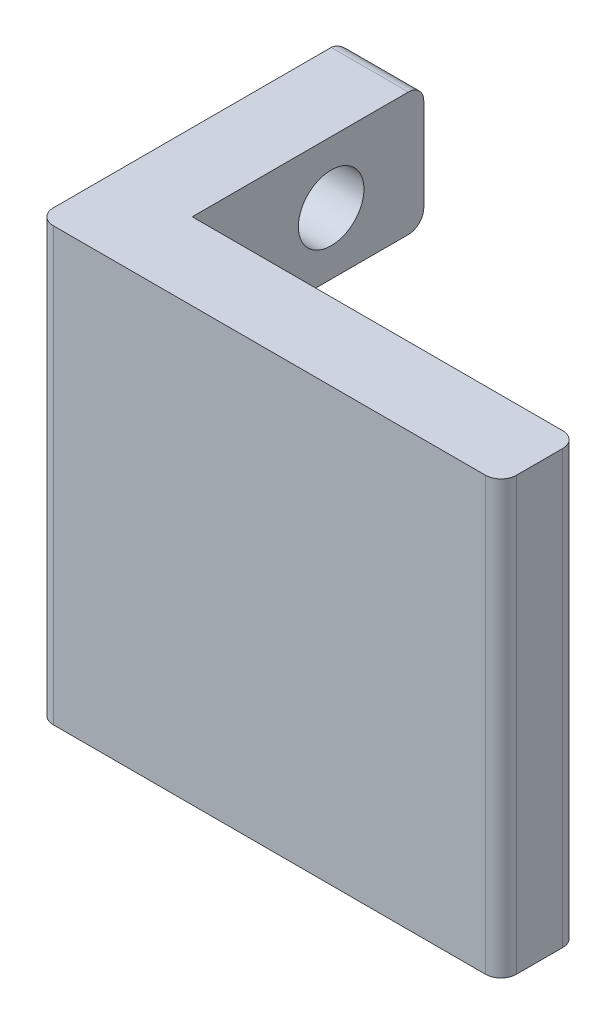
ISO-10303-21;
HEADER;
FILE_DESCRIPTION(('STEP AP214'),'2;1');
FILE_NAME('part.step','',(''),(''),'','','');
FILE_SCHEMA(('AUTOMOTIVE_DESIGN { 1 0 10303 214 1 1 1 1 }'));
ENDSEC;
DATA;
#1=APPLICATION_CONTEXT('core data for automotive mechanical design processes');
#2=APPLICATION_PROTOCOL_DEFINITION('international standard','automotive_design',2000,#1);
#3=PRODUCT_CONTEXT('',#1,'mechanical');
#4=PRODUCT('Part','Part','',(#3));
#5=PRODUCT_RELATED_PRODUCT_CATEGORY('part','',(#4));
#6=PRODUCT_DEFINITION_FORMATION('','',#4);
#7=PRODUCT_DEFINITION_CONTEXT('part definition',#1,'design');
#8=PRODUCT_DEFINITION('design','',#6,#7);
#9=PRODUCT_DEFINITION_SHAPE('','',#8);
#10=(LENGTH_UNIT() NAMED_UNIT(*) SI_UNIT(.MILLI.,.METRE.));
#11=(NAMED_UNIT(*) PLANE_ANGLE_UNIT() SI_UNIT($,.RADIAN.));
#12=(NAMED_UNIT(*) SI_UNIT($,.STERADIAN.) SOLID_ANGLE_UNIT());
#13=UNCERTAINTY_MEASURE_WITH_UNIT(LENGTH_MEASURE(1.E-05),#10,'distance_accuracy_value','');
#14=(GEOMETRIC_REPRESENTATION_CONTEXT(3) GLOBAL_UNCERTAINTY_ASSIGNED_CONTEXT((#13)) GLOBAL_UNIT_ASSIGNED_CONTEXT((#10,
#11,#12)) REPRESENTATION_CONTEXT('',''));
#15=CARTESIAN_POINT('',(0.,0.,0.));
#16=DIRECTION('',(0.,0.,1.));
#17=DIRECTION('',(1.,0.,0.));
#18=AXIS2_PLACEMENT_3D('',#15,#16,#17);
#19=CARTESIAN_POINT('',(12.5,28.,-2.5));
#20=DIRECTION('',(-1.,0.,0.));
#21=DIRECTION('',(0.,0.,1.));
#22=AXIS2_PLACEMENT_3D('',#19,#20,#21);
#23=PLANE('',#22);
#24=DIRECTION('',(0.,0.,-1.));
#25=VECTOR('',#24,1.);
#26=CARTESIAN_POINT('',(12.5,0.,-2.5));
#27=LINE('',#26,#25);
#28=CARTESIAN_POINT('',(12.5,0.,1.5));
#29=VERTEX_POINT('',#28);
#30=CARTESIAN_POINT('',(12.5,0.,-1.5));
#31=VERTEX_POINT('',#30);
#32=EDGE_CURVE('E221',#29,#31,#27,.T.);
#33=ORIENTED_EDGE('',*,*,#32,.T.);
#34=DIRECTION('',(0.,-1.,0.));
#35=VECTOR('',#34,1.);
#36=CARTESIAN_POINT('',(12.5,28.,-1.5));
#37=LINE('',#36,#35);
#38=CARTESIAN_POINT('',(12.5,28.,-1.5));
#39=VERTEX_POINT('',#38);
#40=EDGE_CURVE('E293',#31,#39,#37,.F.);
#41=ORIENTED_EDGE('',*,*,#40,.T.);
#42=DIRECTION('',(0.,0.,-1.));
#43=VECTOR('',#42,1.);
#44=CARTESIAN_POINT('',(12.5,28.,-2.5));
#45=LINE('',#44,#43);
#46=CARTESIAN_POINT('',(12.5,28.,1.5));
#47=VERTEX_POINT('',#46);
#48=EDGE_CURVE('E447',#47,#39,#45,.T.);
#49=ORIENTED_EDGE('',*,*,#48,.F.);
#50=DIRECTION('',(0.,-1.,0.));
#51=VECTOR('',#50,1.);
#52=CARTESIAN_POINT('',(12.5,28.,1.5));
#53=LINE('',#52,#51);
#54=EDGE_CURVE('E289',#47,#29,#53,.T.);
#55=ORIENTED_EDGE('',*,*,#54,.T.);
#56=EDGE_LOOP('',(#33,#41,#49,#55));
#57=FACE_BOUND('',#56,.T.);
#58=ADVANCED_FACE('F47',(#57),#23,.F.);
#59=CARTESIAN_POINT('',(-12.5,28.,-2.5));
#60=DIRECTION('',(0.,0.,1.));
#61=DIRECTION('',(1.,0.,0.));
#62=AXIS2_PLACEMENT_3D('',#59,#60,#61);
#63=PLANE('',#62);
#64=DIRECTION('',(-1.,0.,0.));
#65=VECTOR('',#64,1.);
#66=CARTESIAN_POINT('',(-12.5,28.,-2.5));
#67=LINE('',#66,#65);
#68=CARTESIAN_POINT('',(11.5,28.,-2.5));
#69=VERTEX_POINT('',#68);
#70=CARTESIAN_POINT('',(-12.5,28.,-2.5));
#71=VERTEX_POINT('',#70);
#72=EDGE_CURVE('E235',#69,#71,#67,.T.);
#73=ORIENTED_EDGE('',*,*,#72,.F.);
#74=DIRECTION('',(0.,-1.,0.));
#75=VECTOR('',#74,1.);
#76=CARTESIAN_POINT('',(11.5,28.,-2.5));
#77=LINE('',#76,#75);
#78=CARTESIAN_POINT('',(11.5,0.,-2.5));
#79=VERTEX_POINT('',#78);
#80=EDGE_CURVE('E218',#69,#79,#77,.T.);
#81=ORIENTED_EDGE('',*,*,#80,.T.);
#82=DIRECTION('',(-1.,0.,0.));
#83=VECTOR('',#82,1.);
#84=CARTESIAN_POINT('',(-12.5,0.,-2.5));
#85=LINE('',#84,#83);
#86=CARTESIAN_POINT('',(-12.5,0.,-2.5));
#87=VERTEX_POINT('',#86);
#88=EDGE_CURVE('E200',#79,#87,#85,.T.);
#89=ORIENTED_EDGE('',*,*,#88,.T.);
#90=DIRECTION('',(0.,-1.,0.));
#91=VECTOR('',#90,1.);
#92=CARTESIAN_POINT('',(-12.5,28.,-2.5));
#93=LINE('',#92,#91);
#94=CARTESIAN_POINT('',(-12.5,8.99999999999999,-2.5));
#95=VERTEX_POINT('',#94);
#96=EDGE_CURVE('E215',#95,#87,#93,.T.);
#97=ORIENTED_EDGE('',*,*,#96,.F.);
#98=DIRECTION('',(1.,0.,0.));
#99=VECTOR('',#98,1.);
#100=CARTESIAN_POINT('',(-17.5,8.99999999999999,-2.5));
#101=LINE('',#100,#99);
#102=CARTESIAN_POINT('',(-16.5,8.99999999999999,-2.5));
#103=VERTEX_POINT('',#102);
#104=EDGE_CURVE('E273',#95,#103,#101,.F.);
#105=ORIENTED_EDGE('',*,*,#104,.T.);
#106=DIRECTION('',(0.,-1.,0.));
#107=VECTOR('',#106,1.);
#108=CARTESIAN_POINT('',(-16.5,28.,-2.5));
#109=LINE('',#108,#107);
#110=CARTESIAN_POINT('',(-16.5,19.,-2.5));
#111=VERTEX_POINT('',#110);
#112=EDGE_CURVE('E270',#103,#111,#109,.F.);
#113=ORIENTED_EDGE('',*,*,#112,.T.);
#114=DIRECTION('',(1.,0.,0.));
#115=VECTOR('',#114,1.);
#116=CARTESIAN_POINT('',(-12.5,19.,-2.5));
#117=LINE('',#116,#115);
#118=CARTESIAN_POINT('',(-12.5,19.,-2.5));
#119=VERTEX_POINT('',#118);
#120=EDGE_CURVE('E266',#111,#119,#117,.T.);
#121=ORIENTED_EDGE('',*,*,#120,.T.);
#122=EDGE_CURVE('E228',#71,#119,#93,.T.);
#123=ORIENTED_EDGE('',*,*,#122,.F.);
#124=EDGE_LOOP('',(#73,#81,#89,#97,#105,#113,#121,#123));
#125=FACE_BOUND('',#124,.T.);
#126=ADVANCED_FACE('F214',(#125),#63,.F.);
#127=CARTESIAN_POINT('',(-12.5,28.,2.5));
#128=DIRECTION('',(0.,0.,-1.));
#129=DIRECTION('',(-1.,0.,0.));
#130=AXIS2_PLACEMENT_3D('',#127,#128,#129);
#131=PLANE('',#130);
#132=DIRECTION('',(1.,0.,0.));
#133=VECTOR('',#132,1.);
#134=CARTESIAN_POINT('',(-12.5,0.,2.5));
#135=LINE('',#134,#133);
#136=CARTESIAN_POINT('',(-16.5,0.,2.5));
#137=VERTEX_POINT('',#136);
#138=CARTESIAN_POINT('',(11.5,0.,2.5));
#139=VERTEX_POINT('',#138);
#140=EDGE_CURVE('E220',#137,#139,#135,.T.);
#141=ORIENTED_EDGE('',*,*,#140,.T.);
#142=DIRECTION('',(0.,-1.,0.));
#143=VECTOR('',#142,1.);
#144=CARTESIAN_POINT('',(11.5,28.,2.5));
#145=LINE('',#144,#143);
#146=CARTESIAN_POINT('',(11.5,28.,2.5));
#147=VERTEX_POINT('',#146);
#148=EDGE_CURVE('E357',#139,#147,#145,.F.);
#149=ORIENTED_EDGE('',*,*,#148,.T.);
#150=DIRECTION('',(1.,0.,0.));
#151=VECTOR('',#150,1.);
#152=CARTESIAN_POINT('',(-12.5,28.,2.5));
#153=LINE('',#152,#151);
#154=CARTESIAN_POINT('',(-16.5,28.,2.5));
#155=VERTEX_POINT('',#154);
#156=EDGE_CURVE('E229',#155,#147,#153,.T.);
#157=ORIENTED_EDGE('',*,*,#156,.F.);
#158=DIRECTION('',(0.,1.,0.));
#159=VECTOR('',#158,1.);
#160=CARTESIAN_POINT('',(-16.5,28.,2.5));
#161=LINE('',#160,#159);
#162=EDGE_CURVE('E354',#155,#137,#161,.F.);
#163=ORIENTED_EDGE('',*,*,#162,.T.);
#164=EDGE_LOOP('',(#141,#149,#157,#163));
#165=FACE_BOUND('',#164,.T.);
#166=ADVANCED_FACE('F550',(#165),#131,.F.);
#167=CARTESIAN_POINT('',(0.,28.,0.));
#168=DIRECTION('',(0.,1.,0.));
#169=DIRECTION('',(0.,0.,1.));
#170=AXIS2_PLACEMENT_3D('',#167,#168,#169);
#171=PLANE('',#170);
#172=ORIENTED_EDGE('',*,*,#48,.T.);
#173=CARTESIAN_POINT('',(11.5,28.,-1.5));
#174=DIRECTION('',(0.,1.,0.));
#175=DIRECTION('',(0.,0.,1.));
#176=AXIS2_PLACEMENT_3D('',#173,#174,#175);
#177=CIRCLE('',#176,1.);
#178=EDGE_CURVE('E305',#39,#69,#177,.T.);
#179=ORIENTED_EDGE('',*,*,#178,.T.);
#180=ORIENTED_EDGE('',*,*,#72,.T.);
#181=DIRECTION('',(0.,0.,-1.));
#182=VECTOR('',#181,1.);
#183=CARTESIAN_POINT('',(-12.5,28.,2.5));
#184=LINE('',#183,#182);
#185=CARTESIAN_POINT('',(-12.5,28.,-16.5));
#186=VERTEX_POINT('',#185);
#187=EDGE_CURVE('E418',#71,#186,#184,.T.);
#188=ORIENTED_EDGE('',*,*,#187,.T.);
#189=DIRECTION('',(1.,0.,0.));
#190=VECTOR('',#189,1.);
#191=CARTESIAN_POINT('',(-17.5,28.,-16.5));
#192=LINE('',#191,#190);
#193=CARTESIAN_POINT('',(-17.5,28.,-16.5));
#194=VERTEX_POINT('',#193);
#195=EDGE_CURVE('E302',#186,#194,#192,.F.);
#196=ORIENTED_EDGE('',*,*,#195,.T.);
#197=DIRECTION('',(0.,0.,-1.));
#198=VECTOR('',#197,1.);
#199=CARTESIAN_POINT('',(-17.5,28.,2.5));
#200=LINE('',#199,#198);
#201=CARTESIAN_POINT('',(-17.5,28.,1.5));
#202=VERTEX_POINT('',#201);
#203=EDGE_CURVE('E208',#202,#194,#200,.T.);
#204=ORIENTED_EDGE('',*,*,#203,.F.);
#205=CARTESIAN_POINT('',(-16.5,28.,1.5));
#206=DIRECTION('',(0.,1.,0.));
#207=DIRECTION('',(0.,0.,1.));
#208=AXIS2_PLACEMENT_3D('',#205,#206,#207);
#209=CIRCLE('',#208,1.);
#210=EDGE_CURVE('E296',#202,#155,#209,.T.);
#211=ORIENTED_EDGE('',*,*,#210,.T.);
#212=ORIENTED_EDGE('',*,*,#156,.T.);
#213=CARTESIAN_POINT('',(11.5,28.,1.5));
#214=DIRECTION('',(0.,1.,0.));
#215=DIRECTION('',(0.,0.,1.));
#216=AXIS2_PLACEMENT_3D('',#213,#214,#215);
#217=CIRCLE('',#216,1.);
#218=EDGE_CURVE('E299',#147,#47,#217,.T.);
#219=ORIENTED_EDGE('',*,*,#218,.T.);
#220=EDGE_LOOP('',(#172,#179,#180,#188,#196,#204,#211,#212,#219));
#221=FACE_BOUND('',#220,.T.);
#222=ADVANCED_FACE('F557',(#221),#171,.T.);
#223=CARTESIAN_POINT('',(0.,0.,0.));
#224=DIRECTION('',(0.,1.,0.));
#225=DIRECTION('',(0.,0.,1.));
#226=AXIS2_PLACEMENT_3D('',#223,#224,#225);
#227=PLANE('',#226);
#228=ORIENTED_EDGE('',*,*,#88,.F.);
#229=CARTESIAN_POINT('',(11.5,0.,-1.5));
#230=DIRECTION('',(0.,1.,0.));
#231=DIRECTION('',(0.,0.,1.));
#232=AXIS2_PLACEMENT_3D('',#229,#230,#231);
#233=CIRCLE('',#232,1.);
#234=EDGE_CURVE('E286',#79,#31,#233,.F.);
#235=ORIENTED_EDGE('',*,*,#234,.T.);
#236=ORIENTED_EDGE('',*,*,#32,.F.);
#237=CARTESIAN_POINT('',(11.5,0.,1.5));
#238=DIRECTION('',(0.,1.,0.));
#239=DIRECTION('',(0.,0.,1.));
#240=AXIS2_PLACEMENT_3D('',#237,#238,#239);
#241=CIRCLE('',#240,1.);
#242=EDGE_CURVE('E281',#29,#139,#241,.F.);
#243=ORIENTED_EDGE('',*,*,#242,.T.);
#244=ORIENTED_EDGE('',*,*,#140,.F.);
#245=CARTESIAN_POINT('',(-16.5,0.,1.5));
#246=DIRECTION('',(0.,1.,0.));
#247=DIRECTION('',(0.,0.,1.));
#248=AXIS2_PLACEMENT_3D('',#245,#246,#247);
#249=CIRCLE('',#248,1.);
#250=CARTESIAN_POINT('',(-17.5,0.,1.5));
#251=VERTEX_POINT('',#250);
#252=EDGE_CURVE('E278',#137,#251,#249,.F.);
#253=ORIENTED_EDGE('',*,*,#252,.T.);
#254=DIRECTION('',(0.,0.,1.));
#255=VECTOR('',#254,1.);
#256=CARTESIAN_POINT('',(-17.5,0.,2.5));
#257=LINE('',#256,#255);
#258=CARTESIAN_POINT('',(-17.5,0.,-16.5));
#259=VERTEX_POINT('',#258);
#260=EDGE_CURVE('E435',#259,#251,#257,.T.);
#261=ORIENTED_EDGE('',*,*,#260,.F.);
#262=DIRECTION('',(1.,0.,0.));
#263=VECTOR('',#262,1.);
#264=CARTESIAN_POINT('',(0.,0.,-16.5));
#265=LINE('',#264,#263);
#266=CARTESIAN_POINT('',(-12.5,0.,-16.5));
#267=VERTEX_POINT('',#266);
#268=EDGE_CURVE('E203',#259,#267,#265,.T.);
#269=ORIENTED_EDGE('',*,*,#268,.T.);
#270=DIRECTION('',(0.,0.,1.));
#271=VECTOR('',#270,1.);
#272=CARTESIAN_POINT('',(-12.5,0.,2.5));
#273=LINE('',#272,#271);
#274=EDGE_CURVE('E197',#267,#87,#273,.T.);
#275=ORIENTED_EDGE('',*,*,#274,.T.);
#276=EDGE_LOOP('',(#228,#235,#236,#243,#244,#253,#261,#269,#275));
#277=FACE_BOUND('',#276,.T.);
#278=ADVANCED_FACE('F199',(#277),#227,.F.);
#279=CARTESIAN_POINT('',(-12.5,0.,0.));
#280=DIRECTION('',(1.,0.,0.));
#281=DIRECTION('',(0.,0.,-1.));
#282=AXIS2_PLACEMENT_3D('',#279,#280,#281);
#283=PLANE('',#282);
#284=CARTESIAN_POINT('',(-12.5,24.,-11.5));
#285=DIRECTION('',(1.,0.,0.));
#286=DIRECTION('',(0.,0.,-1.));
#287=AXIS2_PLACEMENT_3D('',#284,#285,#286);
#288=CIRCLE('',#287,2.125);
#289=CARTESIAN_POINT('',(-12.5,24.,-13.625));
#290=VERTEX_POINT('',#289);
#291=EDGE_CURVE('E474',#290,#290,#288,.F.);
#292=ORIENTED_EDGE('',*,*,#291,.T.);
#293=EDGE_LOOP('',(#292));
#294=FACE_BOUND('',#293,.T.);
#295=DIRECTION('',(0.,-1.,0.));
#296=VECTOR('',#295,1.);
#297=CARTESIAN_POINT('',(-12.5,28.,-17.5));
#298=LINE('',#297,#296);
#299=CARTESIAN_POINT('',(-12.5,27.,-17.5));
#300=VERTEX_POINT('',#299);
#301=CARTESIAN_POINT('',(-12.5,21.,-17.5));
#302=VERTEX_POINT('',#301);
#303=EDGE_CURVE('E425',#300,#302,#298,.T.);
#304=ORIENTED_EDGE('',*,*,#303,.F.);
#305=CARTESIAN_POINT('',(-12.5,27.,-16.5));
#306=DIRECTION('',(1.,0.,0.));
#307=DIRECTION('',(0.,0.,-1.));
#308=AXIS2_PLACEMENT_3D('',#305,#306,#307);
#309=CIRCLE('',#308,1.);
#310=EDGE_CURVE('E344',#300,#186,#309,.T.);
#311=ORIENTED_EDGE('',*,*,#310,.T.);
#312=ORIENTED_EDGE('',*,*,#187,.F.);
#313=ORIENTED_EDGE('',*,*,#122,.T.);
#314=CARTESIAN_POINT('',(-12.5,19.,-3.5));
#315=DIRECTION('',(1.,0.,0.));
#316=DIRECTION('',(0.,0.,-1.));
#317=AXIS2_PLACEMENT_3D('',#314,#315,#316);
#318=CIRCLE('',#317,1.);
#319=CARTESIAN_POINT('',(-12.5,20.,-3.5));
#320=VERTEX_POINT('',#319);
#321=EDGE_CURVE('E12',#119,#320,#318,.F.);
#322=ORIENTED_EDGE('',*,*,#321,.T.);
#323=DIRECTION('',(0.,0.,1.));
#324=VECTOR('',#323,1.);
#325=CARTESIAN_POINT('',(-12.5,20.,-17.5));
#326=LINE('',#325,#324);
#327=CARTESIAN_POINT('',(-12.5,20.,-16.5));
#328=VERTEX_POINT('',#327);
#329=EDGE_CURVE('E432',#328,#320,#326,.T.);
#330=ORIENTED_EDGE('',*,*,#329,.F.);
#331=CARTESIAN_POINT('',(-12.5,21.,-16.5));
#332=DIRECTION('',(1.,0.,0.));
#333=DIRECTION('',(0.,0.,-1.));
#334=AXIS2_PLACEMENT_3D('',#331,#332,#333);
#335=CIRCLE('',#334,1.);
#336=EDGE_CURVE('E341',#328,#302,#335,.T.);
#337=ORIENTED_EDGE('',*,*,#336,.T.);
#338=EDGE_LOOP('',(#304,#311,#312,#313,#322,#330,#337));
#339=FACE_BOUND('',#338,.T.);
#340=ADVANCED_FACE('F539',(#294,#339),#283,.T.);
#341=CARTESIAN_POINT('',(-17.5,28.,-17.5));
#342=DIRECTION('',(0.,0.,1.));
#343=DIRECTION('',(1.,0.,0.));
#344=AXIS2_PLACEMENT_3D('',#341,#342,#343);
#345=PLANE('',#344);
#346=DIRECTION('',(0.,-1.,0.));
#347=VECTOR('',#346,1.);
#348=CARTESIAN_POINT('',(-16.5,28.,-17.5));
#349=LINE('',#348,#347);
#350=CARTESIAN_POINT('',(-16.5,21.,-17.5));
#351=VERTEX_POINT('',#350);
#352=CARTESIAN_POINT('',(-16.5,27.,-17.5));
#353=VERTEX_POINT('',#352);
#354=EDGE_CURVE('E332',#351,#353,#349,.F.);
#355=ORIENTED_EDGE('',*,*,#354,.T.);
#356=DIRECTION('',(1.,0.,0.));
#357=VECTOR('',#356,1.);
#358=CARTESIAN_POINT('',(-12.5,27.,-17.5));
#359=LINE('',#358,#357);
#360=EDGE_CURVE('E338',#353,#300,#359,.T.);
#361=ORIENTED_EDGE('',*,*,#360,.T.);
#362=ORIENTED_EDGE('',*,*,#303,.T.);
#363=DIRECTION('',(1.,0.,0.));
#364=VECTOR('',#363,1.);
#365=CARTESIAN_POINT('',(-17.5,21.,-17.5));
#366=LINE('',#365,#364);
#367=EDGE_CURVE('E335',#302,#351,#366,.F.);
#368=ORIENTED_EDGE('',*,*,#367,.T.);
#369=EDGE_LOOP('',(#355,#361,#362,#368));
#370=FACE_BOUND('',#369,.T.);
#371=ADVANCED_FACE('F632',(#370),#345,.F.);
#372=CARTESIAN_POINT('',(-17.5,20.,-17.5));
#373=DIRECTION('',(0.,1.,0.));
#374=DIRECTION('',(0.,0.,1.));
#375=AXIS2_PLACEMENT_3D('',#372,#373,#374);
#376=PLANE('',#375);
#377=DIRECTION('',(0.,0.,1.));
#378=VECTOR('',#377,1.);
#379=CARTESIAN_POINT('',(-16.5,20.,-17.5));
#380=LINE('',#379,#378);
#381=CARTESIAN_POINT('',(-16.5,20.,-3.5));
#382=VERTEX_POINT('',#381);
#383=CARTESIAN_POINT('',(-16.5,20.,-16.5));
#384=VERTEX_POINT('',#383);
#385=EDGE_CURVE('E65',#382,#384,#380,.F.);
#386=ORIENTED_EDGE('',*,*,#385,.T.);
#387=DIRECTION('',(1.,0.,0.));
#388=VECTOR('',#387,1.);
#389=CARTESIAN_POINT('',(-17.5,20.,-16.5));
#390=LINE('',#389,#388);
#391=EDGE_CURVE('E351',#384,#328,#390,.T.);
#392=ORIENTED_EDGE('',*,*,#391,.T.);
#393=ORIENTED_EDGE('',*,*,#329,.T.);
#394=DIRECTION('',(1.,0.,0.));
#395=VECTOR('',#394,1.);
#396=CARTESIAN_POINT('',(-17.5,20.,-3.5));
#397=LINE('',#396,#395);
#398=EDGE_CURVE('E70',#320,#382,#397,.F.);
#399=ORIENTED_EDGE('',*,*,#398,.T.);
#400=EDGE_LOOP('',(#386,#392,#393,#399));
#401=FACE_BOUND('',#400,.T.);
#402=ADVANCED_FACE('F536',(#401),#376,.F.);
#403=CARTESIAN_POINT('',(-17.5,7.99999999999999,-17.5));
#404=DIRECTION('',(0.,-1.,0.));
#405=DIRECTION('',(0.,0.,-1.));
#406=AXIS2_PLACEMENT_3D('',#403,#404,#405);
#407=PLANE('',#406);
#408=DIRECTION('',(0.,0.,-1.));
#409=VECTOR('',#408,1.);
#410=CARTESIAN_POINT('',(-12.5,7.99999999999999,-17.5));
#411=LINE('',#410,#409);
#412=CARTESIAN_POINT('',(-12.5,7.99999999999999,-3.5));
#413=VERTEX_POINT('',#412);
#414=CARTESIAN_POINT('',(-12.5,7.99999999999999,-16.5));
#415=VERTEX_POINT('',#414);
#416=EDGE_CURVE('E440',#413,#415,#411,.T.);
#417=ORIENTED_EDGE('',*,*,#416,.T.);
#418=DIRECTION('',(1.,0.,0.));
#419=VECTOR('',#418,1.);
#420=CARTESIAN_POINT('',(-17.5,7.99999999999999,-16.5));
#421=LINE('',#420,#419);
#422=CARTESIAN_POINT('',(-16.5,7.99999999999999,-16.5));
#423=VERTEX_POINT('',#422);
#424=EDGE_CURVE('E329',#415,#423,#421,.F.);
#425=ORIENTED_EDGE('',*,*,#424,.T.);
#426=DIRECTION('',(0.,0.,-1.));
#427=VECTOR('',#426,1.);
#428=CARTESIAN_POINT('',(-16.5,7.99999999999999,-17.5));
#429=LINE('',#428,#427);
#430=CARTESIAN_POINT('',(-16.5,7.99999999999999,-3.5));
#431=VERTEX_POINT('',#430);
#432=EDGE_CURVE('E326',#423,#431,#429,.F.);
#433=ORIENTED_EDGE('',*,*,#432,.T.);
#434=DIRECTION('',(1.,0.,0.));
#435=VECTOR('',#434,1.);
#436=CARTESIAN_POINT('',(-12.5,7.99999999999999,-3.5));
#437=LINE('',#436,#435);
#438=EDGE_CURVE('E323',#431,#413,#437,.T.);
#439=ORIENTED_EDGE('',*,*,#438,.T.);
#440=EDGE_LOOP('',(#417,#425,#433,#439));
#441=FACE_BOUND('',#440,.T.);
#442=ADVANCED_FACE('F503',(#441),#407,.F.);
#443=CARTESIAN_POINT('',(-17.5,7.99999999999999,-17.5));
#444=DIRECTION('',(0.,0.,1.));
#445=DIRECTION('',(1.,0.,0.));
#446=AXIS2_PLACEMENT_3D('',#443,#444,#445);
#447=PLANE('',#446);
#448=DIRECTION('',(0.,-1.,0.));
#449=VECTOR('',#448,1.);
#450=CARTESIAN_POINT('',(-12.5,7.99999999999999,-17.5));
#451=LINE('',#450,#449);
#452=CARTESIAN_POINT('',(-12.5,6.99999999999999,-17.5));
#453=VERTEX_POINT('',#452);
#454=CARTESIAN_POINT('',(-12.5,1.,-17.5));
#455=VERTEX_POINT('',#454);
#456=EDGE_CURVE('E209',#453,#455,#451,.T.);
#457=ORIENTED_EDGE('',*,*,#456,.T.);
#458=DIRECTION('',(1.,0.,0.));
#459=VECTOR('',#458,1.);
#460=CARTESIAN_POINT('',(-17.5,1.,-17.5));
#461=LINE('',#460,#459);
#462=CARTESIAN_POINT('',(-16.5,1.,-17.5));
#463=VERTEX_POINT('',#462);
#464=EDGE_CURVE('E320',#455,#463,#461,.F.);
#465=ORIENTED_EDGE('',*,*,#464,.T.);
#466=DIRECTION('',(0.,-1.,0.));
#467=VECTOR('',#466,1.);
#468=CARTESIAN_POINT('',(-16.5,7.99999999999999,-17.5));
#469=LINE('',#468,#467);
#470=CARTESIAN_POINT('',(-16.5,6.99999999999999,-17.5));
#471=VERTEX_POINT('',#470);
#472=EDGE_CURVE('E314',#463,#471,#469,.F.);
#473=ORIENTED_EDGE('',*,*,#472,.T.);
#474=DIRECTION('',(1.,0.,0.));
#475=VECTOR('',#474,1.);
#476=CARTESIAN_POINT('',(-17.5,6.99999999999999,-17.5));
#477=LINE('',#476,#475);
#478=EDGE_CURVE('E317',#471,#453,#477,.T.);
#479=ORIENTED_EDGE('',*,*,#478,.T.);
#480=EDGE_LOOP('',(#457,#465,#473,#479));
#481=FACE_BOUND('',#480,.T.);
#482=ADVANCED_FACE('F487',(#481),#447,.F.);
#483=CARTESIAN_POINT('',(-17.5,0.,0.));
#484=DIRECTION('',(1.,0.,0.));
#485=DIRECTION('',(0.,0.,-1.));
#486=AXIS2_PLACEMENT_3D('',#483,#484,#485);
#487=PLANE('',#486);
#488=CARTESIAN_POINT('',(-17.5,24.,-11.5));
#489=DIRECTION('',(-1.,0.,0.));
#490=DIRECTION('',(0.,0.,1.));
#491=AXIS2_PLACEMENT_3D('',#488,#489,#490);
#492=CIRCLE('',#491,2.125);
#493=CARTESIAN_POINT('',(-17.5,24.,-9.375));
#494=VERTEX_POINT('',#493);
#495=EDGE_CURVE('E366',#494,#494,#492,.T.);
#496=ORIENTED_EDGE('',*,*,#495,.F.);
#497=EDGE_LOOP('',(#496));
#498=FACE_BOUND('',#497,.T.);
#499=CARTESIAN_POINT('',(-17.5,3.99999999999999,-11.5));
#500=DIRECTION('',(-1.,0.,0.));
#501=DIRECTION('',(0.,0.,1.));
#502=AXIS2_PLACEMENT_3D('',#499,#500,#501);
#503=CIRCLE('',#502,2.125);
#504=CARTESIAN_POINT('',(-17.5,3.99999999999999,-9.375));
#505=VERTEX_POINT('',#504);
#506=EDGE_CURVE('E466',#505,#505,#503,.T.);
#507=ORIENTED_EDGE('',*,*,#506,.F.);
#508=EDGE_LOOP('',(#507));
#509=FACE_BOUND('',#508,.T.);
#510=DIRECTION('',(0.,0.,-1.));
#511=VECTOR('',#510,1.);
#512=CARTESIAN_POINT('',(-17.5,6.99999999999999,0.));
#513=LINE('',#512,#511);
#514=CARTESIAN_POINT('',(-17.5,6.99999999999999,-3.5));
#515=VERTEX_POINT('',#514);
#516=CARTESIAN_POINT('',(-17.5,6.99999999999999,-16.5));
#517=VERTEX_POINT('',#516);
#518=EDGE_CURVE('E260',#515,#517,#513,.T.);
#519=ORIENTED_EDGE('',*,*,#518,.T.);
#520=DIRECTION('',(0.,-1.,0.));
#521=VECTOR('',#520,1.);
#522=CARTESIAN_POINT('',(-17.5,0.,-16.5));
#523=LINE('',#522,#521);
#524=EDGE_CURVE('E263',#517,#259,#523,.T.);
#525=ORIENTED_EDGE('',*,*,#524,.T.);
#526=ORIENTED_EDGE('',*,*,#260,.T.);
#527=DIRECTION('',(0.,1.,0.));
#528=VECTOR('',#527,1.);
#529=CARTESIAN_POINT('',(-17.5,0.,1.5));
#530=LINE('',#529,#528);
#531=EDGE_CURVE('E233',#251,#202,#530,.T.);
#532=ORIENTED_EDGE('',*,*,#531,.T.);
#533=ORIENTED_EDGE('',*,*,#203,.T.);
#534=DIRECTION('',(0.,-1.,0.));
#535=VECTOR('',#534,1.);
#536=CARTESIAN_POINT('',(-17.5,0.,-16.5));
#537=LINE('',#536,#535);
#538=CARTESIAN_POINT('',(-17.5,21.,-16.5));
#539=VERTEX_POINT('',#538);
#540=EDGE_CURVE('E242',#194,#539,#537,.T.);
#541=ORIENTED_EDGE('',*,*,#540,.T.);
#542=DIRECTION('',(0.,0.,1.));
#543=VECTOR('',#542,1.);
#544=CARTESIAN_POINT('',(-17.5,21.,0.));
#545=LINE('',#544,#543);
#546=CARTESIAN_POINT('',(-17.5,21.,-3.5));
#547=VERTEX_POINT('',#546);
#548=EDGE_CURVE('E245',#539,#547,#545,.T.);
#549=ORIENTED_EDGE('',*,*,#548,.T.);
#550=CARTESIAN_POINT('',(-17.5,19.,-3.5));
#551=DIRECTION('',(1.,0.,0.));
#552=DIRECTION('',(0.,0.,-1.));
#553=AXIS2_PLACEMENT_3D('',#550,#551,#552);
#554=CIRCLE('',#553,2.);
#555=CARTESIAN_POINT('',(-17.5,19.,-1.5));
#556=VERTEX_POINT('',#555);
#557=EDGE_CURVE('E248',#556,#547,#554,.F.);
#558=ORIENTED_EDGE('',*,*,#557,.F.);
#559=DIRECTION('',(0.,-1.,0.));
#560=VECTOR('',#559,1.);
#561=CARTESIAN_POINT('',(-17.5,0.,-1.5));
#562=LINE('',#561,#560);
#563=CARTESIAN_POINT('',(-17.5,8.99999999999999,-1.5));
#564=VERTEX_POINT('',#563);
#565=EDGE_CURVE('E252',#556,#564,#562,.T.);
#566=ORIENTED_EDGE('',*,*,#565,.T.);
#567=CARTESIAN_POINT('',(-17.5,8.99999999999999,-3.5));
#568=DIRECTION('',(1.,0.,0.));
#569=DIRECTION('',(0.,0.,-1.));
#570=AXIS2_PLACEMENT_3D('',#567,#568,#569);
#571=CIRCLE('',#570,2.);
#572=EDGE_CURVE('E256',#515,#564,#571,.F.);
#573=ORIENTED_EDGE('',*,*,#572,.F.);
#574=EDGE_LOOP('',(#519,#525,#526,#532,#533,#541,#549,#558,#566,#573));
#575=FACE_BOUND('',#574,.T.);
#576=ADVANCED_FACE('F484',(#498,#509,#575),#487,.F.);
#577=CARTESIAN_POINT('',(-12.5,3.99999999999999,-11.5));
#578=DIRECTION('',(1.,0.,0.));
#579=DIRECTION('',(0.,0.,-1.));
#580=AXIS2_PLACEMENT_3D('',#577,#578,#579);
#581=CIRCLE('',#580,2.125);
#582=CARTESIAN_POINT('',(-12.5,3.99999999999999,-13.625));
#583=VERTEX_POINT('',#582);
#584=EDGE_CURVE('E470',#583,#583,#581,.F.);
#585=ORIENTED_EDGE('',*,*,#584,.T.);
#586=EDGE_LOOP('',(#585));
#587=FACE_BOUND('',#586,.T.);
#588=ORIENTED_EDGE('',*,*,#274,.F.);
#589=CARTESIAN_POINT('',(-12.5,1.,-16.5));
#590=DIRECTION('',(1.,0.,0.));
#591=DIRECTION('',(0.,0.,-1.));
#592=AXIS2_PLACEMENT_3D('',#589,#590,#591);
#593=CIRCLE('',#592,1.);
#594=EDGE_CURVE('E311',#267,#455,#593,.T.);
#595=ORIENTED_EDGE('',*,*,#594,.T.);
#596=ORIENTED_EDGE('',*,*,#456,.F.);
#597=CARTESIAN_POINT('',(-12.5,6.99999999999999,-16.5));
#598=DIRECTION('',(1.,0.,0.));
#599=DIRECTION('',(0.,0.,-1.));
#600=AXIS2_PLACEMENT_3D('',#597,#598,#599);
#601=CIRCLE('',#600,1.);
#602=EDGE_CURVE('E308',#453,#415,#601,.T.);
#603=ORIENTED_EDGE('',*,*,#602,.T.);
#604=ORIENTED_EDGE('',*,*,#416,.F.);
#605=CARTESIAN_POINT('',(-12.5,8.99999999999999,-3.5));
#606=DIRECTION('',(1.,0.,0.));
#607=DIRECTION('',(0.,0.,-1.));
#608=AXIS2_PLACEMENT_3D('',#605,#606,#607);
#609=CIRCLE('',#608,1.);
#610=EDGE_CURVE('E57',#413,#95,#609,.F.);
#611=ORIENTED_EDGE('',*,*,#610,.T.);
#612=ORIENTED_EDGE('',*,*,#96,.T.);
#613=EDGE_LOOP('',(#588,#595,#596,#603,#604,#611,#612));
#614=FACE_BOUND('',#613,.T.);
#615=ADVANCED_FACE('F223',(#587,#614),#283,.T.);
#616=CARTESIAN_POINT('',(-17.5,27.,-16.5));
#617=DIRECTION('',(-1.,0.,0.));
#618=DIRECTION('',(0.,0.,1.));
#619=AXIS2_PLACEMENT_3D('',#616,#617,#618);
#620=CYLINDRICAL_SURFACE('',#619,1.);
#621=ORIENTED_EDGE('',*,*,#310,.F.);
#622=ORIENTED_EDGE('',*,*,#360,.F.);
#623=CARTESIAN_POINT('',(-16.5,27.,-16.5));
#624=DIRECTION('',(-0.707106781186547,-0.707106781186547,0.));
#625=DIRECTION('',(0.707106781186547,-0.707106781186547,0.));
#626=AXIS2_PLACEMENT_3D('',#623,#624,#625);
#627=ELLIPSE('',#626,1.41421356237309,1.);
#628=EDGE_CURVE('E51',#194,#353,#627,.T.);
#629=ORIENTED_EDGE('',*,*,#628,.F.);
#630=ORIENTED_EDGE('',*,*,#195,.F.);
#631=EDGE_LOOP('',(#621,#622,#629,#630));
#632=FACE_BOUND('',#631,.T.);
#633=ADVANCED_FACE('F600',(#632),#620,.T.);
#634=CARTESIAN_POINT('',(0.,1.,-16.5));
#635=DIRECTION('',(1.,0.,0.));
#636=DIRECTION('',(0.,0.,-1.));
#637=AXIS2_PLACEMENT_3D('',#634,#635,#636);
#638=CYLINDRICAL_SURFACE('',#637,1.);
#639=ORIENTED_EDGE('',*,*,#594,.F.);
#640=ORIENTED_EDGE('',*,*,#268,.F.);
#641=CARTESIAN_POINT('',(-16.5,1.,-16.5));
#642=DIRECTION('',(0.707106781186547,-0.707106781186547,0.));
#643=DIRECTION('',(-0.707106781186547,-0.707106781186547,0.));
#644=AXIS2_PLACEMENT_3D('',#641,#642,#643);
#645=ELLIPSE('',#644,1.41421356237309,1.);
#646=EDGE_CURVE('E409',#463,#259,#645,.F.);
#647=ORIENTED_EDGE('',*,*,#646,.F.);
#648=ORIENTED_EDGE('',*,*,#464,.F.);
#649=EDGE_LOOP('',(#639,#640,#647,#648));
#650=FACE_BOUND('',#649,.T.);
#651=ADVANCED_FACE('F597',(#650),#638,.T.);
#652=CARTESIAN_POINT('',(-17.5,21.,-16.5));
#653=DIRECTION('',(1.,0.,0.));
#654=DIRECTION('',(0.,0.,-1.));
#655=AXIS2_PLACEMENT_3D('',#652,#653,#654);
#656=CYLINDRICAL_SURFACE('',#655,1.);
#657=ORIENTED_EDGE('',*,*,#336,.F.);
#658=ORIENTED_EDGE('',*,*,#391,.F.);
#659=CARTESIAN_POINT('',(-16.5,21.,-16.5));
#660=DIRECTION('',(-1.,0.,0.));
#661=DIRECTION('',(0.,0.,1.));
#662=AXIS2_PLACEMENT_3D('',#659,#660,#661);
#663=CIRCLE('',#662,1.);
#664=EDGE_CURVE('E406',#351,#384,#663,.T.);
#665=ORIENTED_EDGE('',*,*,#664,.F.);
#666=ORIENTED_EDGE('',*,*,#367,.F.);
#667=EDGE_LOOP('',(#657,#658,#665,#666));
#668=FACE_BOUND('',#667,.T.);
#669=ADVANCED_FACE('F534',(#668),#656,.T.);
#670=CARTESIAN_POINT('',(-16.5,0.,-16.5));
#671=DIRECTION('',(0.,-1.,0.));
#672=DIRECTION('',(0.,0.,-1.));
#673=AXIS2_PLACEMENT_3D('',#670,#671,#672);
#674=CYLINDRICAL_SURFACE('',#673,1.);
#675=ORIENTED_EDGE('',*,*,#628,.T.);
#676=ORIENTED_EDGE('',*,*,#354,.F.);
#677=CARTESIAN_POINT('',(-16.5,21.,-16.5));
#678=DIRECTION('',(0.,-1.,0.));
#679=DIRECTION('',(0.,0.,-1.));
#680=AXIS2_PLACEMENT_3D('',#677,#678,#679);
#681=CIRCLE('',#680,1.);
#682=EDGE_CURVE('E402',#539,#351,#681,.T.);
#683=ORIENTED_EDGE('',*,*,#682,.F.);
#684=ORIENTED_EDGE('',*,*,#540,.F.);
#685=EDGE_LOOP('',(#675,#676,#683,#684));
#686=FACE_BOUND('',#685,.T.);
#687=ADVANCED_FACE('F592',(#686),#674,.T.);
#688=CARTESIAN_POINT('',(-16.5,0.,-16.5));
#689=DIRECTION('',(0.,-1.,0.));
#690=DIRECTION('',(0.,0.,-1.));
#691=AXIS2_PLACEMENT_3D('',#688,#689,#690);
#692=CYLINDRICAL_SURFACE('',#691,1.);
#693=ORIENTED_EDGE('',*,*,#646,.T.);
#694=ORIENTED_EDGE('',*,*,#524,.F.);
#695=CARTESIAN_POINT('',(-16.5,6.99999999999999,-16.5));
#696=DIRECTION('',(0.,1.,0.));
#697=DIRECTION('',(0.,0.,1.));
#698=AXIS2_PLACEMENT_3D('',#695,#696,#697);
#699=CIRCLE('',#698,1.);
#700=EDGE_CURVE('E398',#471,#517,#699,.T.);
#701=ORIENTED_EDGE('',*,*,#700,.F.);
#702=ORIENTED_EDGE('',*,*,#472,.F.);
#703=EDGE_LOOP('',(#693,#694,#701,#702));
#704=FACE_BOUND('',#703,.T.);
#705=ADVANCED_FACE('F494',(#704),#692,.T.);
#706=CARTESIAN_POINT('',(-17.5,6.99999999999999,-16.5));
#707=DIRECTION('',(1.,0.,0.));
#708=DIRECTION('',(0.,0.,-1.));
#709=AXIS2_PLACEMENT_3D('',#706,#707,#708);
#710=CYLINDRICAL_SURFACE('',#709,1.);
#711=ORIENTED_EDGE('',*,*,#602,.F.);
#712=ORIENTED_EDGE('',*,*,#478,.F.);
#713=CARTESIAN_POINT('',(-16.5,6.99999999999999,-16.5));
#714=DIRECTION('',(-1.,0.,0.));
#715=DIRECTION('',(0.,0.,1.));
#716=AXIS2_PLACEMENT_3D('',#713,#714,#715);
#717=CIRCLE('',#716,1.);
#718=EDGE_CURVE('E394',#423,#471,#717,.T.);
#719=ORIENTED_EDGE('',*,*,#718,.F.);
#720=ORIENTED_EDGE('',*,*,#424,.F.);
#721=EDGE_LOOP('',(#711,#712,#719,#720));
#722=FACE_BOUND('',#721,.T.);
#723=ADVANCED_FACE('F586',(#722),#710,.T.);
#724=CARTESIAN_POINT('',(-16.5,21.,-16.5));
#725=DIRECTION('',(0.,0.,-1.));
#726=DIRECTION('',(-1.,0.,0.));
#727=AXIS2_PLACEMENT_3D('',#724,#725,#726);
#728=SPHERICAL_SURFACE('',#727,1.);
#729=ORIENTED_EDGE('',*,*,#682,.T.);
#730=ORIENTED_EDGE('',*,*,#664,.T.);
#731=CARTESIAN_POINT('',(-16.5,21.,-16.5));
#732=DIRECTION('',(0.,0.,-1.));
#733=DIRECTION('',(-1.,0.,0.));
#734=AXIS2_PLACEMENT_3D('',#731,#732,#733);
#735=CIRCLE('',#734,1.);
#736=EDGE_CURVE('E390',#539,#384,#735,.F.);
#737=ORIENTED_EDGE('',*,*,#736,.F.);
#738=EDGE_LOOP('',(#729,#730,#737));
#739=FACE_BOUND('',#738,.T.);
#740=ADVANCED_FACE('F529',(#739),#728,.T.);
#741=CARTESIAN_POINT('',(-16.5,6.99999999999999,-16.5));
#742=DIRECTION('',(0.,0.,-1.));
#743=DIRECTION('',(-1.,0.,0.));
#744=AXIS2_PLACEMENT_3D('',#741,#742,#743);
#745=SPHERICAL_SURFACE('',#744,1.);
#746=ORIENTED_EDGE('',*,*,#718,.T.);
#747=ORIENTED_EDGE('',*,*,#700,.T.);
#748=CARTESIAN_POINT('',(-16.5,6.99999999999999,-16.5));
#749=DIRECTION('',(0.,0.,-1.));
#750=DIRECTION('',(-1.,0.,0.));
#751=AXIS2_PLACEMENT_3D('',#748,#749,#750);
#752=CIRCLE('',#751,1.);
#753=EDGE_CURVE('E386',#423,#517,#752,.F.);
#754=ORIENTED_EDGE('',*,*,#753,.F.);
#755=EDGE_LOOP('',(#746,#747,#754));
#756=FACE_BOUND('',#755,.T.);
#757=ADVANCED_FACE('F497',(#756),#745,.T.);
#758=CARTESIAN_POINT('',(-12.5,19.,-3.5));
#759=DIRECTION('',(-1.,0.,0.));
#760=DIRECTION('',(0.,0.,1.));
#761=AXIS2_PLACEMENT_3D('',#758,#759,#760);
#762=CYLINDRICAL_SURFACE('',#761,1.);
#763=ORIENTED_EDGE('',*,*,#321,.F.);
#764=ORIENTED_EDGE('',*,*,#120,.F.);
#765=CARTESIAN_POINT('',(-16.5,19.,-3.5));
#766=DIRECTION('',(1.,0.,0.));
#767=DIRECTION('',(0.,0.,-1.));
#768=AXIS2_PLACEMENT_3D('',#765,#766,#767);
#769=CIRCLE('',#768,1.);
#770=EDGE_CURVE('E382',#382,#111,#769,.T.);
#771=ORIENTED_EDGE('',*,*,#770,.F.);
#772=ORIENTED_EDGE('',*,*,#398,.F.);
#773=EDGE_LOOP('',(#763,#764,#771,#772));
#774=FACE_BOUND('',#773,.T.);
#775=ADVANCED_FACE('F516',(#774),#762,.F.);
#776=CARTESIAN_POINT('',(-16.5,21.,0.));
#777=DIRECTION('',(0.,0.,1.));
#778=DIRECTION('',(1.,0.,0.));
#779=AXIS2_PLACEMENT_3D('',#776,#777,#778);
#780=CYLINDRICAL_SURFACE('',#779,1.);
#781=ORIENTED_EDGE('',*,*,#736,.T.);
#782=ORIENTED_EDGE('',*,*,#385,.F.);
#783=CARTESIAN_POINT('',(-16.5,21.,-3.5));
#784=DIRECTION('',(0.,0.,1.));
#785=DIRECTION('',(1.,0.,0.));
#786=AXIS2_PLACEMENT_3D('',#783,#784,#785);
#787=CIRCLE('',#786,1.);
#788=EDGE_CURVE('E378',#547,#382,#787,.T.);
#789=ORIENTED_EDGE('',*,*,#788,.F.);
#790=ORIENTED_EDGE('',*,*,#548,.F.);
#791=EDGE_LOOP('',(#781,#782,#789,#790));
#792=FACE_BOUND('',#791,.T.);
#793=ADVANCED_FACE('F526',(#792),#780,.T.);
#794=CARTESIAN_POINT('',(-16.5,6.99999999999999,0.));
#795=DIRECTION('',(0.,0.,-1.));
#796=DIRECTION('',(-1.,0.,0.));
#797=AXIS2_PLACEMENT_3D('',#794,#795,#796);
#798=CYLINDRICAL_SURFACE('',#797,1.);
#799=ORIENTED_EDGE('',*,*,#753,.T.);
#800=ORIENTED_EDGE('',*,*,#518,.F.);
#801=CARTESIAN_POINT('',(-16.5,6.99999999999999,-3.5));
#802=DIRECTION('',(0.,0.,1.));
#803=DIRECTION('',(1.,0.,0.));
#804=AXIS2_PLACEMENT_3D('',#801,#802,#803);
#805=CIRCLE('',#804,1.);
#806=EDGE_CURVE('E374',#431,#515,#805,.T.);
#807=ORIENTED_EDGE('',*,*,#806,.F.);
#808=ORIENTED_EDGE('',*,*,#432,.F.);
#809=EDGE_LOOP('',(#799,#800,#807,#808));
#810=FACE_BOUND('',#809,.T.);
#811=ADVANCED_FACE('F500',(#810),#798,.T.);
#812=CARTESIAN_POINT('',(-17.5,8.99999999999999,-3.5));
#813=DIRECTION('',(-1.,0.,0.));
#814=DIRECTION('',(0.,0.,1.));
#815=AXIS2_PLACEMENT_3D('',#812,#813,#814);
#816=CYLINDRICAL_SURFACE('',#815,1.);
#817=ORIENTED_EDGE('',*,*,#610,.F.);
#818=ORIENTED_EDGE('',*,*,#438,.F.);
#819=CARTESIAN_POINT('',(-16.5,8.99999999999999,-3.5));
#820=DIRECTION('',(1.,0.,0.));
#821=DIRECTION('',(0.,0.,-1.));
#822=AXIS2_PLACEMENT_3D('',#819,#820,#821);
#823=CIRCLE('',#822,1.);
#824=EDGE_CURVE('E370',#103,#431,#823,.T.);
#825=ORIENTED_EDGE('',*,*,#824,.F.);
#826=ORIENTED_EDGE('',*,*,#104,.F.);
#827=EDGE_LOOP('',(#817,#818,#825,#826));
#828=FACE_BOUND('',#827,.T.);
#829=ADVANCED_FACE('F507',(#828),#816,.F.);
#830=CARTESIAN_POINT('',(-16.5,19.,-3.5));
#831=DIRECTION('',(1.,0.,0.));
#832=DIRECTION('',(0.,0.,-1.));
#833=AXIS2_PLACEMENT_3D('',#830,#831,#832);
#834=TOROIDAL_SURFACE('',#833,2.,1.);
#835=ORIENTED_EDGE('',*,*,#788,.T.);
#836=ORIENTED_EDGE('',*,*,#770,.T.);
#837=CARTESIAN_POINT('',(-16.5,19.,-1.5));
#838=DIRECTION('',(0.,1.,0.));
#839=DIRECTION('',(0.,0.,1.));
#840=AXIS2_PLACEMENT_3D('',#837,#838,#839);
#841=CIRCLE('',#840,1.);
#842=EDGE_CURVE('E365',#556,#111,#841,.F.);
#843=ORIENTED_EDGE('',*,*,#842,.F.);
#844=ORIENTED_EDGE('',*,*,#557,.T.);
#845=EDGE_LOOP('',(#835,#836,#843,#844));
#846=FACE_BOUND('',#845,.T.);
#847=ADVANCED_FACE('F519',(#846),#834,.T.);
#848=CARTESIAN_POINT('',(-16.5,8.99999999999999,-3.5));
#849=DIRECTION('',(1.,0.,0.));
#850=DIRECTION('',(0.,0.,-1.));
#851=AXIS2_PLACEMENT_3D('',#848,#849,#850);
#852=TOROIDAL_SURFACE('',#851,2.,1.);
#853=ORIENTED_EDGE('',*,*,#806,.T.);
#854=ORIENTED_EDGE('',*,*,#572,.T.);
#855=CARTESIAN_POINT('',(-16.5,8.99999999999999,-1.5));
#856=DIRECTION('',(0.,-1.,0.));
#857=DIRECTION('',(0.,0.,-1.));
#858=AXIS2_PLACEMENT_3D('',#855,#856,#857);
#859=CIRCLE('',#858,1.);
#860=EDGE_CURVE('E362',#103,#564,#859,.F.);
#861=ORIENTED_EDGE('',*,*,#860,.F.);
#862=ORIENTED_EDGE('',*,*,#824,.T.);
#863=EDGE_LOOP('',(#853,#854,#861,#862));
#864=FACE_BOUND('',#863,.T.);
#865=ADVANCED_FACE('F568',(#864),#852,.T.);
#866=CARTESIAN_POINT('',(-16.5,0.,-1.5));
#867=DIRECTION('',(0.,-1.,0.));
#868=DIRECTION('',(0.,0.,-1.));
#869=AXIS2_PLACEMENT_3D('',#866,#867,#868);
#870=CYLINDRICAL_SURFACE('',#869,1.);
#871=ORIENTED_EDGE('',*,*,#842,.T.);
#872=ORIENTED_EDGE('',*,*,#112,.F.);
#873=ORIENTED_EDGE('',*,*,#860,.T.);
#874=ORIENTED_EDGE('',*,*,#565,.F.);
#875=EDGE_LOOP('',(#871,#872,#873,#874));
#876=FACE_BOUND('',#875,.T.);
#877=ADVANCED_FACE('F522',(#876),#870,.T.);
#878=CARTESIAN_POINT('',(11.5,28.,-1.5));
#879=DIRECTION('',(0.,-1.,0.));
#880=DIRECTION('',(0.,0.,-1.));
#881=AXIS2_PLACEMENT_3D('',#878,#879,#880);
#882=CYLINDRICAL_SURFACE('',#881,1.);
#883=ORIENTED_EDGE('',*,*,#178,.F.);
#884=ORIENTED_EDGE('',*,*,#40,.F.);
#885=ORIENTED_EDGE('',*,*,#234,.F.);
#886=ORIENTED_EDGE('',*,*,#80,.F.);
#887=EDGE_LOOP('',(#883,#884,#885,#886));
#888=FACE_BOUND('',#887,.T.);
#889=ADVANCED_FACE('F542',(#888),#882,.T.);
#890=CARTESIAN_POINT('',(11.5,28.,1.5));
#891=DIRECTION('',(0.,-1.,0.));
#892=DIRECTION('',(0.,0.,-1.));
#893=AXIS2_PLACEMENT_3D('',#890,#891,#892);
#894=CYLINDRICAL_SURFACE('',#893,1.);
#895=ORIENTED_EDGE('',*,*,#218,.F.);
#896=ORIENTED_EDGE('',*,*,#148,.F.);
#897=ORIENTED_EDGE('',*,*,#242,.F.);
#898=ORIENTED_EDGE('',*,*,#54,.F.);
#899=EDGE_LOOP('',(#895,#896,#897,#898));
#900=FACE_BOUND('',#899,.T.);
#901=ADVANCED_FACE('F555',(#900),#894,.T.);
#902=CARTESIAN_POINT('',(-16.5,0.,1.5));
#903=DIRECTION('',(0.,1.,0.));
#904=DIRECTION('',(0.,0.,1.));
#905=AXIS2_PLACEMENT_3D('',#902,#903,#904);
#906=CYLINDRICAL_SURFACE('',#905,1.);
#907=ORIENTED_EDGE('',*,*,#252,.F.);
#908=ORIENTED_EDGE('',*,*,#162,.F.);
#909=ORIENTED_EDGE('',*,*,#210,.F.);
#910=ORIENTED_EDGE('',*,*,#531,.F.);
#911=EDGE_LOOP('',(#907,#908,#909,#910));
#912=FACE_BOUND('',#911,.T.);
#913=ADVANCED_FACE('F49',(#912),#906,.T.);
#914=CARTESIAN_POINT('',(12.501,3.99999999999999,-11.5));
#915=DIRECTION('',(-1.,0.,0.));
#916=DIRECTION('',(0.,0.,1.));
#917=AXIS2_PLACEMENT_3D('',#914,#915,#916);
#918=CYLINDRICAL_SURFACE('',#917,2.125);
#919=ORIENTED_EDGE('',*,*,#584,.F.);
#920=EDGE_LOOP('',(#919));
#921=FACE_BOUND('',#920,.T.);
#922=ORIENTED_EDGE('',*,*,#506,.T.);
#923=EDGE_LOOP('',(#922));
#924=FACE_BOUND('',#923,.T.);
#925=ADVANCED_FACE('F610',(#921,#924),#918,.F.);
#926=CARTESIAN_POINT('',(12.501,24.,-11.5));
#927=DIRECTION('',(-1.,0.,0.));
#928=DIRECTION('',(0.,0.,1.));
#929=AXIS2_PLACEMENT_3D('',#926,#927,#928);
#930=CYLINDRICAL_SURFACE('',#929,2.125);
#931=ORIENTED_EDGE('',*,*,#291,.F.);
#932=EDGE_LOOP('',(#931));
#933=FACE_BOUND('',#932,.T.);
#934=ORIENTED_EDGE('',*,*,#495,.T.);
#935=EDGE_LOOP('',(#934));
#936=FACE_BOUND('',#935,.T.);
#937=ADVANCED_FACE('F482',(#933,#936),#930,.F.);
#938=CLOSED_SHELL('',(#58,#126,#166,#222,#278,#340,#371,#402,#442,#482,#576,#615,#633,#651,#669,
#687,#705,#723,#740,#757,#775,#793,#811,#829,#847,#865,#877,#889,#901,#913,#925,#937));
#939=MANIFOLD_SOLID_BREP('B2',#938);
#940=ADVANCED_BREP_SHAPE_REPRESENTATION('',(#18,#939),#14);
#941=SHAPE_DEFINITION_REPRESENTATION(#9,#940);
ENDSEC;
END-ISO-10303-21;
